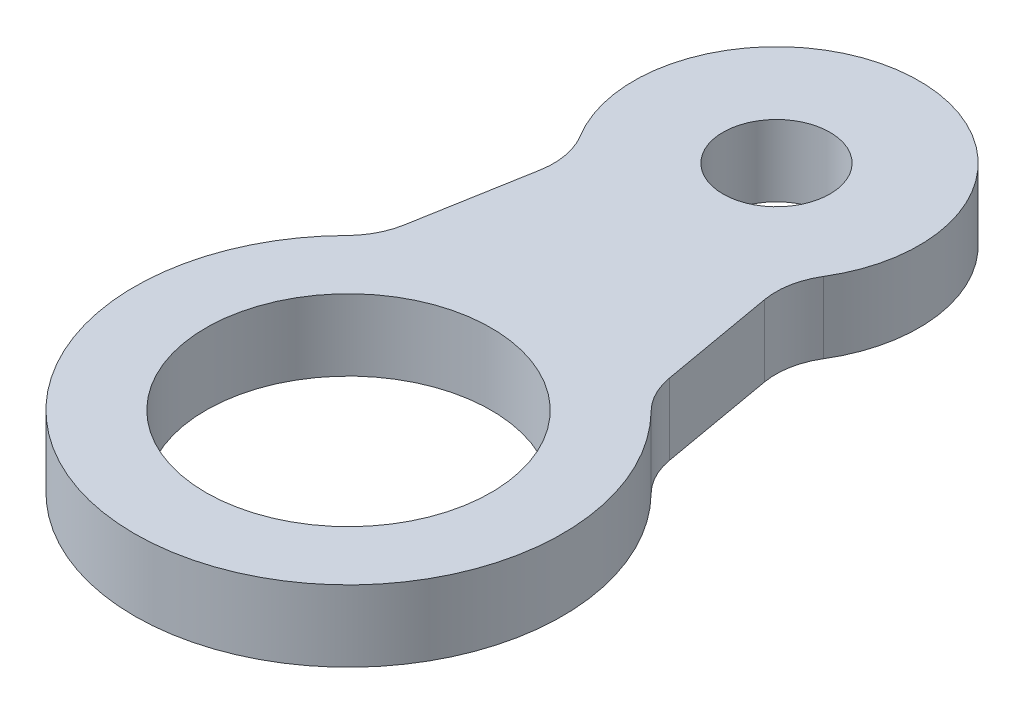
ISO-10303-21;
HEADER;
FILE_DESCRIPTION(('STEP AP214'),'2;1');
FILE_NAME('part.step','',(''),(''),'','','');
FILE_SCHEMA(('AUTOMOTIVE_DESIGN { 1 0 10303 214 1 1 1 1 }'));
ENDSEC;
DATA;
#1=APPLICATION_CONTEXT('core data for automotive mechanical design processes');
#2=APPLICATION_PROTOCOL_DEFINITION('international standard','automotive_design',2000,#1);
#3=PRODUCT_CONTEXT('',#1,'mechanical');
#4=PRODUCT('Part','Part','',(#3));
#5=PRODUCT_RELATED_PRODUCT_CATEGORY('part','',(#4));
#6=PRODUCT_DEFINITION_FORMATION('','',#4);
#7=PRODUCT_DEFINITION_CONTEXT('part definition',#1,'design');
#8=PRODUCT_DEFINITION('design','',#6,#7);
#9=PRODUCT_DEFINITION_SHAPE('','',#8);
#10=(LENGTH_UNIT() NAMED_UNIT(*) SI_UNIT(.MILLI.,.METRE.));
#11=(NAMED_UNIT(*) PLANE_ANGLE_UNIT() SI_UNIT($,.RADIAN.));
#12=(NAMED_UNIT(*) SI_UNIT($,.STERADIAN.) SOLID_ANGLE_UNIT());
#13=UNCERTAINTY_MEASURE_WITH_UNIT(LENGTH_MEASURE(1.E-05),#10,'distance_accuracy_value','');
#14=(GEOMETRIC_REPRESENTATION_CONTEXT(3) GLOBAL_UNCERTAINTY_ASSIGNED_CONTEXT((#13)) GLOBAL_UNIT_ASSIGNED_CONTEXT((#10,
#11,#12)) REPRESENTATION_CONTEXT('',''));
#15=CARTESIAN_POINT('',(0.,0.,0.));
#16=DIRECTION('',(0.,0.,1.));
#17=DIRECTION('',(1.,0.,0.));
#18=AXIS2_PLACEMENT_3D('',#15,#16,#17);
#19=CARTESIAN_POINT('',(0.,12.7,-76.2));
#20=DIRECTION('',(0.,1.,0.));
#21=DIRECTION('',(0.,0.,1.));
#22=AXIS2_PLACEMENT_3D('',#19,#20,#21);
#23=PLANE('',#22);
#24=CARTESIAN_POINT('',(0.,12.7,0.));
#25=DIRECTION('',(0.,1.,0.));
#26=DIRECTION('',(0.,0.,1.));
#27=AXIS2_PLACEMENT_3D('',#24,#25,#26);
#28=CIRCLE('',#27,25.4);
#29=CARTESIAN_POINT('',(0.,12.7,25.4));
#30=VERTEX_POINT('',#29);
#31=EDGE_CURVE('E125',#30,#30,#28,.T.);
#32=ORIENTED_EDGE('',*,*,#31,.F.);
#33=EDGE_LOOP('',(#32));
#34=FACE_BOUND('',#33,.T.);
#35=DIRECTION('',(-0.173648177666932,0.,-0.984807753012208));
#36=VECTOR('',#35,1.);
#37=CARTESIAN_POINT('',(24.3579162597458,12.7,-29.2967901907908));
#38=LINE('',#37,#36);
#39=CARTESIAN_POINT('',(23.6142597591815,12.7,-33.5142757824811));
#40=VERTEX_POINT('',#39);
#41=CARTESIAN_POINT('',(19.9848355558466,12.7,-54.0977632825349));
#42=VERTEX_POINT('',#41);
#43=EDGE_CURVE('E133',#40,#42,#38,.T.);
#44=ORIENTED_EDGE('',*,*,#43,.T.);
#45=CARTESIAN_POINT('',(32.4918940191016,12.7,-56.3030951389049));
#46=DIRECTION('',(0.,1.,0.));
#47=DIRECTION('',(0.,0.,1.));
#48=AXIS2_PLACEMENT_3D('',#45,#46,#47);
#49=CIRCLE('',#48,12.7);
#50=CARTESIAN_POINT('',(21.6612626794011,12.7,-62.93539675927));
#51=VERTEX_POINT('',#50);
#52=EDGE_CURVE('E108',#42,#51,#49,.F.);
#53=ORIENTED_EDGE('',*,*,#52,.T.);
#54=CARTESIAN_POINT('',(0.,12.7,-76.2));
#55=DIRECTION('',(0.,1.,0.));
#56=DIRECTION('',(0.,0.,1.));
#57=AXIS2_PLACEMENT_3D('',#54,#55,#56);
#58=CIRCLE('',#57,25.4);
#59=CARTESIAN_POINT('',(-21.6612626794011,12.7,-62.93539675927));
#60=VERTEX_POINT('',#59);
#61=EDGE_CURVE('E116',#51,#60,#58,.T.);
#62=ORIENTED_EDGE('',*,*,#61,.T.);
#63=CARTESIAN_POINT('',(-32.4918940191016,12.7,-56.3030951389049));
#64=DIRECTION('',(0.,1.,0.));
#65=DIRECTION('',(0.,0.,1.));
#66=AXIS2_PLACEMENT_3D('',#63,#64,#65);
#67=CIRCLE('',#66,12.7);
#68=CARTESIAN_POINT('',(-19.9848355558466,12.7,-54.0977632825349));
#69=VERTEX_POINT('',#68);
#70=EDGE_CURVE('E54',#60,#69,#67,.F.);
#71=ORIENTED_EDGE('',*,*,#70,.T.);
#72=DIRECTION('',(-0.173648177666932,0.,0.984807753012208));
#73=VECTOR('',#72,1.);
#74=CARTESIAN_POINT('',(-24.3579162597458,12.7,-29.2967901907908));
#75=LINE('',#74,#73);
#76=CARTESIAN_POINT('',(-23.6142597591815,12.7,-33.5142757824811));
#77=VERTEX_POINT('',#76);
#78=EDGE_CURVE('E175',#69,#77,#75,.T.);
#79=ORIENTED_EDGE('',*,*,#78,.T.);
#80=CARTESIAN_POINT('',(-36.1213182224366,12.7,-35.7196076388512));
#81=DIRECTION('',(0.,1.,0.));
#82=DIRECTION('',(0.,0.,1.));
#83=AXIS2_PLACEMENT_3D('',#80,#81,#82);
#84=CIRCLE('',#83,12.7);
#85=CARTESIAN_POINT('',(-27.0909886668274,12.7,-26.7897057291384));
#86=VERTEX_POINT('',#85);
#87=EDGE_CURVE('E156',#77,#86,#84,.F.);
#88=ORIENTED_EDGE('',*,*,#87,.T.);
#89=CARTESIAN_POINT('',(0.,12.7,0.));
#90=DIRECTION('',(0.,1.,0.));
#91=DIRECTION('',(0.,0.,1.));
#92=AXIS2_PLACEMENT_3D('',#89,#90,#91);
#93=CIRCLE('',#92,38.1);
#94=CARTESIAN_POINT('',(27.0909886668274,12.7,-26.7897057291384));
#95=VERTEX_POINT('',#94);
#96=EDGE_CURVE('E172',#86,#95,#93,.T.);
#97=ORIENTED_EDGE('',*,*,#96,.T.);
#98=CARTESIAN_POINT('',(36.1213182224366,12.7,-35.7196076388512));
#99=DIRECTION('',(0.,1.,0.));
#100=DIRECTION('',(0.,0.,1.));
#101=AXIS2_PLACEMENT_3D('',#98,#99,#100);
#102=CIRCLE('',#101,12.7);
#103=EDGE_CURVE('E11',#95,#40,#102,.F.);
#104=ORIENTED_EDGE('',*,*,#103,.T.);
#105=EDGE_LOOP('',(#44,#53,#62,#71,#79,#88,#97,#104));
#106=FACE_BOUND('',#105,.T.);
#107=CARTESIAN_POINT('',(0.,12.7,-76.2));
#108=DIRECTION('',(0.,1.,0.));
#109=DIRECTION('',(0.,0.,1.));
#110=AXIS2_PLACEMENT_3D('',#107,#108,#109);
#111=CIRCLE('',#110,9.525);
#112=CARTESIAN_POINT('',(0.,12.7,-66.675));
#113=VERTEX_POINT('',#112);
#114=EDGE_CURVE('E180',#113,#113,#111,.T.);
#115=ORIENTED_EDGE('',*,*,#114,.F.);
#116=EDGE_LOOP('',(#115));
#117=FACE_BOUND('',#116,.T.);
#118=ADVANCED_FACE('F32',(#34,#106,#117),#23,.T.);
#119=CARTESIAN_POINT('',(0.,0.,-76.2));
#120=DIRECTION('',(0.,1.,0.));
#121=DIRECTION('',(0.,0.,1.));
#122=AXIS2_PLACEMENT_3D('',#119,#120,#121);
#123=PLANE('',#122);
#124=CARTESIAN_POINT('',(0.,0.,-76.2));
#125=DIRECTION('',(0.,1.,0.));
#126=DIRECTION('',(0.,0.,1.));
#127=AXIS2_PLACEMENT_3D('',#124,#125,#126);
#128=CIRCLE('',#127,25.4);
#129=CARTESIAN_POINT('',(21.6612626794011,0.,-62.93539675927));
#130=VERTEX_POINT('',#129);
#131=CARTESIAN_POINT('',(-21.6612626794011,0.,-62.93539675927));
#132=VERTEX_POINT('',#131);
#133=EDGE_CURVE('E114',#130,#132,#128,.T.);
#134=ORIENTED_EDGE('',*,*,#133,.F.);
#135=CARTESIAN_POINT('',(32.4918940191016,0.,-56.3030951389049));
#136=DIRECTION('',(0.,1.,0.));
#137=DIRECTION('',(0.,0.,1.));
#138=AXIS2_PLACEMENT_3D('',#135,#136,#137);
#139=CIRCLE('',#138,12.7);
#140=CARTESIAN_POINT('',(19.9848355558466,0.,-54.0977632825349));
#141=VERTEX_POINT('',#140);
#142=EDGE_CURVE('E98',#130,#141,#139,.T.);
#143=ORIENTED_EDGE('',*,*,#142,.T.);
#144=DIRECTION('',(-0.173648177666932,0.,-0.984807753012208));
#145=VECTOR('',#144,1.);
#146=CARTESIAN_POINT('',(24.3579162597458,0.,-29.2967901907908));
#147=LINE('',#146,#145);
#148=CARTESIAN_POINT('',(23.6142597591815,0.,-33.5142757824811));
#149=VERTEX_POINT('',#148);
#150=EDGE_CURVE('E138',#149,#141,#147,.T.);
#151=ORIENTED_EDGE('',*,*,#150,.F.);
#152=CARTESIAN_POINT('',(36.1213182224366,0.,-35.7196076388512));
#153=DIRECTION('',(0.,1.,0.));
#154=DIRECTION('',(0.,0.,1.));
#155=AXIS2_PLACEMENT_3D('',#152,#153,#154);
#156=CIRCLE('',#155,12.7);
#157=CARTESIAN_POINT('',(27.0909886668274,0.,-26.7897057291384));
#158=VERTEX_POINT('',#157);
#159=EDGE_CURVE('E40',#149,#158,#156,.T.);
#160=ORIENTED_EDGE('',*,*,#159,.T.);
#161=CARTESIAN_POINT('',(0.,0.,0.));
#162=DIRECTION('',(0.,1.,0.));
#163=DIRECTION('',(0.,0.,1.));
#164=AXIS2_PLACEMENT_3D('',#161,#162,#163);
#165=CIRCLE('',#164,38.1);
#166=CARTESIAN_POINT('',(-27.0909886668274,0.,-26.7897057291384));
#167=VERTEX_POINT('',#166);
#168=EDGE_CURVE('E127',#167,#158,#165,.T.);
#169=ORIENTED_EDGE('',*,*,#168,.F.);
#170=CARTESIAN_POINT('',(-36.1213182224366,0.,-35.7196076388512));
#171=DIRECTION('',(0.,1.,0.));
#172=DIRECTION('',(0.,0.,1.));
#173=AXIS2_PLACEMENT_3D('',#170,#171,#172);
#174=CIRCLE('',#173,12.7);
#175=CARTESIAN_POINT('',(-23.6142597591815,0.,-33.5142757824811));
#176=VERTEX_POINT('',#175);
#177=EDGE_CURVE('E154',#167,#176,#174,.T.);
#178=ORIENTED_EDGE('',*,*,#177,.T.);
#179=DIRECTION('',(-0.173648177666932,0.,0.984807753012208));
#180=VECTOR('',#179,1.);
#181=CARTESIAN_POINT('',(-24.3579162597458,0.,-29.2967901907908));
#182=LINE('',#181,#180);
#183=CARTESIAN_POINT('',(-19.9848355558466,0.,-54.0977632825349));
#184=VERTEX_POINT('',#183);
#185=EDGE_CURVE('E124',#184,#176,#182,.T.);
#186=ORIENTED_EDGE('',*,*,#185,.F.);
#187=CARTESIAN_POINT('',(-32.4918940191016,0.,-56.3030951389049));
#188=DIRECTION('',(0.,1.,0.));
#189=DIRECTION('',(0.,0.,1.));
#190=AXIS2_PLACEMENT_3D('',#187,#188,#189);
#191=CIRCLE('',#190,12.7);
#192=EDGE_CURVE('E123',#184,#132,#191,.T.);
#193=ORIENTED_EDGE('',*,*,#192,.T.);
#194=EDGE_LOOP('',(#134,#143,#151,#160,#169,#178,#186,#193));
#195=FACE_BOUND('',#194,.T.);
#196=CARTESIAN_POINT('',(0.,0.,0.));
#197=DIRECTION('',(0.,1.,0.));
#198=DIRECTION('',(0.,0.,1.));
#199=AXIS2_PLACEMENT_3D('',#196,#197,#198);
#200=CIRCLE('',#199,25.4);
#201=CARTESIAN_POINT('',(0.,0.,25.4));
#202=VERTEX_POINT('',#201);
#203=EDGE_CURVE('E130',#202,#202,#200,.T.);
#204=ORIENTED_EDGE('',*,*,#203,.T.);
#205=EDGE_LOOP('',(#204));
#206=FACE_BOUND('',#205,.T.);
#207=CARTESIAN_POINT('',(0.,0.,-76.2));
#208=DIRECTION('',(0.,1.,0.));
#209=DIRECTION('',(0.,0.,1.));
#210=AXIS2_PLACEMENT_3D('',#207,#208,#209);
#211=CIRCLE('',#210,9.525);
#212=CARTESIAN_POINT('',(0.,0.,-66.675));
#213=VERTEX_POINT('',#212);
#214=EDGE_CURVE('E182',#213,#213,#211,.T.);
#215=ORIENTED_EDGE('',*,*,#214,.T.);
#216=EDGE_LOOP('',(#215));
#217=FACE_BOUND('',#216,.T.);
#218=ADVANCED_FACE('F120',(#195,#206,#217),#123,.F.);
#219=CARTESIAN_POINT('',(0.,12.7,-76.2));
#220=DIRECTION('',(0.,-1.,0.));
#221=DIRECTION('',(0.,0.,-1.));
#222=AXIS2_PLACEMENT_3D('',#219,#220,#221);
#223=CYLINDRICAL_SURFACE('',#222,25.4);
#224=ORIENTED_EDGE('',*,*,#61,.F.);
#225=DIRECTION('',(0.,-1.,0.));
#226=VECTOR('',#225,1.);
#227=CARTESIAN_POINT('',(21.6612626794011,12.7,-62.93539675927));
#228=LINE('',#227,#226);
#229=EDGE_CURVE('E102',#51,#130,#228,.T.);
#230=ORIENTED_EDGE('',*,*,#229,.T.);
#231=ORIENTED_EDGE('',*,*,#133,.T.);
#232=DIRECTION('',(0.,-1.,0.));
#233=VECTOR('',#232,1.);
#234=CARTESIAN_POINT('',(-21.6612626794011,12.7,-62.93539675927));
#235=LINE('',#234,#233);
#236=EDGE_CURVE('E118',#132,#60,#235,.F.);
#237=ORIENTED_EDGE('',*,*,#236,.T.);
#238=EDGE_LOOP('',(#224,#230,#231,#237));
#239=FACE_BOUND('',#238,.T.);
#240=ADVANCED_FACE('F113',(#239),#223,.T.);
#241=CARTESIAN_POINT('',(-24.3579162597458,12.7,-29.2967901907908));
#242=DIRECTION('',(0.984807753012208,0.,0.173648177666932));
#243=DIRECTION('',(0.173648177666932,0.,-0.984807753012208));
#244=AXIS2_PLACEMENT_3D('',#241,#242,#243);
#245=PLANE('',#244);
#246=ORIENTED_EDGE('',*,*,#185,.T.);
#247=DIRECTION('',(0.,1.,0.));
#248=VECTOR('',#247,1.);
#249=CARTESIAN_POINT('',(-23.6142597591815,12.7,-33.5142757824811));
#250=LINE('',#249,#248);
#251=EDGE_CURVE('E47',#176,#77,#250,.T.);
#252=ORIENTED_EDGE('',*,*,#251,.T.);
#253=ORIENTED_EDGE('',*,*,#78,.F.);
#254=DIRECTION('',(0.,1.,0.));
#255=VECTOR('',#254,1.);
#256=CARTESIAN_POINT('',(-19.9848355558466,0.,-54.0977632825349));
#257=LINE('',#256,#255);
#258=EDGE_CURVE('E149',#69,#184,#257,.F.);
#259=ORIENTED_EDGE('',*,*,#258,.T.);
#260=EDGE_LOOP('',(#246,#252,#253,#259));
#261=FACE_BOUND('',#260,.T.);
#262=ADVANCED_FACE('F206',(#261),#245,.F.);
#263=CARTESIAN_POINT('',(0.,12.7,0.));
#264=DIRECTION('',(0.,-1.,0.));
#265=DIRECTION('',(0.,0.,-1.));
#266=AXIS2_PLACEMENT_3D('',#263,#264,#265);
#267=CYLINDRICAL_SURFACE('',#266,38.1);
#268=ORIENTED_EDGE('',*,*,#96,.F.);
#269=DIRECTION('',(0.,-1.,0.));
#270=VECTOR('',#269,1.);
#271=CARTESIAN_POINT('',(-27.0909886668274,12.7,-26.7897057291384));
#272=LINE('',#271,#270);
#273=EDGE_CURVE('E146',#86,#167,#272,.T.);
#274=ORIENTED_EDGE('',*,*,#273,.T.);
#275=ORIENTED_EDGE('',*,*,#168,.T.);
#276=DIRECTION('',(0.,-1.,0.));
#277=VECTOR('',#276,1.);
#278=CARTESIAN_POINT('',(27.0909886668274,12.7,-26.7897057291384));
#279=LINE('',#278,#277);
#280=EDGE_CURVE('E144',#158,#95,#279,.F.);
#281=ORIENTED_EDGE('',*,*,#280,.T.);
#282=EDGE_LOOP('',(#268,#274,#275,#281));
#283=FACE_BOUND('',#282,.T.);
#284=ADVANCED_FACE('F165',(#283),#267,.T.);
#285=CARTESIAN_POINT('',(24.3579162597458,12.7,-29.2967901907908));
#286=DIRECTION('',(-0.984807753012208,0.,0.173648177666932));
#287=DIRECTION('',(0.173648177666932,0.,0.984807753012208));
#288=AXIS2_PLACEMENT_3D('',#285,#286,#287);
#289=PLANE('',#288);
#290=ORIENTED_EDGE('',*,*,#150,.T.);
#291=DIRECTION('',(0.,1.,0.));
#292=VECTOR('',#291,1.);
#293=CARTESIAN_POINT('',(19.9848355558466,12.7,-54.0977632825349));
#294=LINE('',#293,#292);
#295=EDGE_CURVE('E103',#141,#42,#294,.T.);
#296=ORIENTED_EDGE('',*,*,#295,.T.);
#297=ORIENTED_EDGE('',*,*,#43,.F.);
#298=DIRECTION('',(0.,1.,0.));
#299=VECTOR('',#298,1.);
#300=CARTESIAN_POINT('',(23.6142597591815,0.,-33.5142757824811));
#301=LINE('',#300,#299);
#302=EDGE_CURVE('E117',#40,#149,#301,.F.);
#303=ORIENTED_EDGE('',*,*,#302,.T.);
#304=EDGE_LOOP('',(#290,#296,#297,#303));
#305=FACE_BOUND('',#304,.T.);
#306=ADVANCED_FACE('F174',(#305),#289,.F.);
#307=CARTESIAN_POINT('',(0.,12.7,0.));
#308=DIRECTION('',(0.,-1.,0.));
#309=DIRECTION('',(0.,0.,-1.));
#310=AXIS2_PLACEMENT_3D('',#307,#308,#309);
#311=CYLINDRICAL_SURFACE('',#310,25.4);
#312=ORIENTED_EDGE('',*,*,#31,.T.);
#313=EDGE_LOOP('',(#312));
#314=FACE_BOUND('',#313,.T.);
#315=ORIENTED_EDGE('',*,*,#203,.F.);
#316=EDGE_LOOP('',(#315));
#317=FACE_BOUND('',#316,.T.);
#318=ADVANCED_FACE('F199',(#314,#317),#311,.F.);
#319=CARTESIAN_POINT('',(0.,12.7,-76.2));
#320=DIRECTION('',(0.,-1.,0.));
#321=DIRECTION('',(0.,0.,-1.));
#322=AXIS2_PLACEMENT_3D('',#319,#320,#321);
#323=CYLINDRICAL_SURFACE('',#322,9.525);
#324=ORIENTED_EDGE('',*,*,#114,.T.);
#325=EDGE_LOOP('',(#324));
#326=FACE_BOUND('',#325,.T.);
#327=ORIENTED_EDGE('',*,*,#214,.F.);
#328=EDGE_LOOP('',(#327));
#329=FACE_BOUND('',#328,.T.);
#330=ADVANCED_FACE('F188',(#326,#329),#323,.F.);
#331=CARTESIAN_POINT('',(32.4918940191016,12.7,-56.3030951389049));
#332=DIRECTION('',(0.,-1.,0.));
#333=DIRECTION('',(0.,0.,-1.));
#334=AXIS2_PLACEMENT_3D('',#331,#332,#333);
#335=CYLINDRICAL_SURFACE('',#334,12.7);
#336=ORIENTED_EDGE('',*,*,#52,.F.);
#337=ORIENTED_EDGE('',*,*,#295,.F.);
#338=ORIENTED_EDGE('',*,*,#142,.F.);
#339=ORIENTED_EDGE('',*,*,#229,.F.);
#340=EDGE_LOOP('',(#336,#337,#338,#339));
#341=FACE_BOUND('',#340,.T.);
#342=ADVANCED_FACE('F101',(#341),#335,.F.);
#343=CARTESIAN_POINT('',(-36.1213182224366,12.7,-35.7196076388512));
#344=DIRECTION('',(0.,-1.,0.));
#345=DIRECTION('',(0.,0.,-1.));
#346=AXIS2_PLACEMENT_3D('',#343,#344,#345);
#347=CYLINDRICAL_SURFACE('',#346,12.7);
#348=ORIENTED_EDGE('',*,*,#87,.F.);
#349=ORIENTED_EDGE('',*,*,#251,.F.);
#350=ORIENTED_EDGE('',*,*,#177,.F.);
#351=ORIENTED_EDGE('',*,*,#273,.F.);
#352=EDGE_LOOP('',(#348,#349,#350,#351));
#353=FACE_BOUND('',#352,.T.);
#354=ADVANCED_FACE('F213',(#353),#347,.F.);
#355=CARTESIAN_POINT('',(-32.4918940191016,12.7,-56.3030951389049));
#356=DIRECTION('',(0.,-1.,0.));
#357=DIRECTION('',(0.,0.,-1.));
#358=AXIS2_PLACEMENT_3D('',#355,#356,#357);
#359=CYLINDRICAL_SURFACE('',#358,12.7);
#360=ORIENTED_EDGE('',*,*,#70,.F.);
#361=ORIENTED_EDGE('',*,*,#236,.F.);
#362=ORIENTED_EDGE('',*,*,#192,.F.);
#363=ORIENTED_EDGE('',*,*,#258,.F.);
#364=EDGE_LOOP('',(#360,#361,#362,#363));
#365=FACE_BOUND('',#364,.T.);
#366=ADVANCED_FACE('F215',(#365),#359,.F.);
#367=CARTESIAN_POINT('',(36.1213182224366,12.7,-35.7196076388512));
#368=DIRECTION('',(0.,-1.,0.));
#369=DIRECTION('',(0.,0.,-1.));
#370=AXIS2_PLACEMENT_3D('',#367,#368,#369);
#371=CYLINDRICAL_SURFACE('',#370,12.7);
#372=ORIENTED_EDGE('',*,*,#103,.F.);
#373=ORIENTED_EDGE('',*,*,#280,.F.);
#374=ORIENTED_EDGE('',*,*,#159,.F.);
#375=ORIENTED_EDGE('',*,*,#302,.F.);
#376=EDGE_LOOP('',(#372,#373,#374,#375));
#377=FACE_BOUND('',#376,.T.);
#378=ADVANCED_FACE('F34',(#377),#371,.F.);
#379=CLOSED_SHELL('',(#118,#218,#240,#262,#284,#306,#318,#330,#342,#354,#366,#378));
#380=MANIFOLD_SOLID_BREP('B2',#379);
#381=ADVANCED_BREP_SHAPE_REPRESENTATION('',(#18,#380),#14);
#382=SHAPE_DEFINITION_REPRESENTATION(#9,#381);
ENDSEC;
END-ISO-10303-21;
